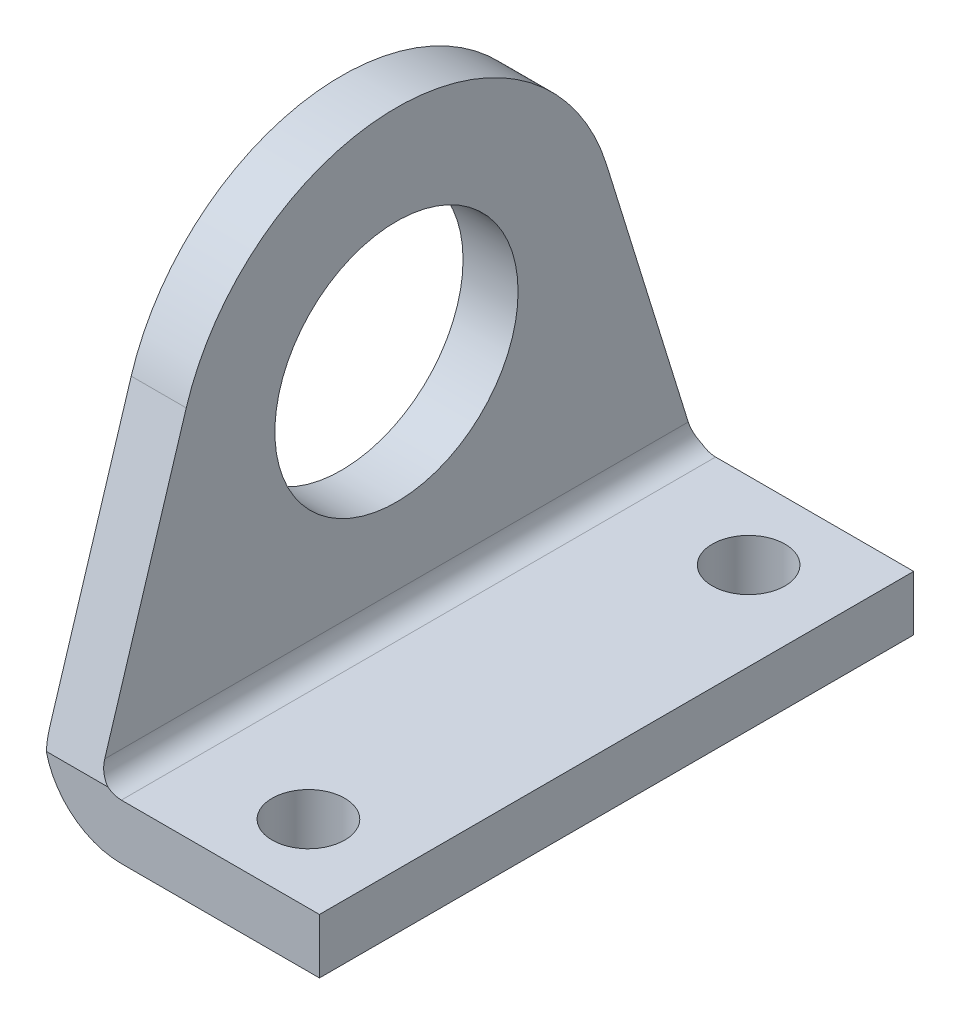
ISO-10303-21;
HEADER;
FILE_DESCRIPTION(('STEP AP214'),'2;1');
FILE_NAME('part.step','',(''),(''),'','','');
FILE_SCHEMA(('AUTOMOTIVE_DESIGN { 1 0 10303 214 1 1 1 1 }'));
ENDSEC;
DATA;
#1=APPLICATION_CONTEXT('core data for automotive mechanical design processes');
#2=APPLICATION_PROTOCOL_DEFINITION('international standard','automotive_design',2000,#1);
#3=PRODUCT_CONTEXT('',#1,'mechanical');
#4=PRODUCT('Part','Part','',(#3));
#5=PRODUCT_RELATED_PRODUCT_CATEGORY('part','',(#4));
#6=PRODUCT_DEFINITION_FORMATION('','',#4);
#7=PRODUCT_DEFINITION_CONTEXT('part definition',#1,'design');
#8=PRODUCT_DEFINITION('design','',#6,#7);
#9=PRODUCT_DEFINITION_SHAPE('','',#8);
#10=(LENGTH_UNIT() NAMED_UNIT(*) SI_UNIT(.MILLI.,.METRE.));
#11=(NAMED_UNIT(*) PLANE_ANGLE_UNIT() SI_UNIT($,.RADIAN.));
#12=(NAMED_UNIT(*) SI_UNIT($,.STERADIAN.) SOLID_ANGLE_UNIT());
#13=UNCERTAINTY_MEASURE_WITH_UNIT(LENGTH_MEASURE(1.E-05),#10,'distance_accuracy_value','');
#14=(GEOMETRIC_REPRESENTATION_CONTEXT(3) GLOBAL_UNCERTAINTY_ASSIGNED_CONTEXT((#13)) GLOBAL_UNIT_ASSIGNED_CONTEXT((#10,
#11,#12)) REPRESENTATION_CONTEXT('',''));
#15=CARTESIAN_POINT('',(0.,0.,0.));
#16=DIRECTION('',(0.,0.,1.));
#17=DIRECTION('',(1.,0.,0.));
#18=AXIS2_PLACEMENT_3D('',#15,#16,#17);
#19=CARTESIAN_POINT('',(17.,5.1,20.));
#20=DIRECTION('',(0.,1.,0.));
#21=DIRECTION('',(0.,0.,1.));
#22=AXIS2_PLACEMENT_3D('',#19,#20,#21);
#23=CYLINDRICAL_SURFACE('',#22,3.3);
#24=CARTESIAN_POINT('',(17.,0.,20.));
#25=DIRECTION('',(0.,1.,0.));
#26=DIRECTION('',(0.,0.,1.));
#27=AXIS2_PLACEMENT_3D('',#24,#25,#26);
#28=CIRCLE('',#27,3.3);
#29=CARTESIAN_POINT('',(17.,0.,23.3));
#30=VERTEX_POINT('',#29);
#31=EDGE_CURVE('E147',#30,#30,#28,.F.);
#32=ORIENTED_EDGE('',*,*,#31,.T.);
#33=EDGE_LOOP('',(#32));
#34=FACE_BOUND('',#33,.T.);
#35=CARTESIAN_POINT('',(17.,5.,20.));
#36=DIRECTION('',(0.,1.,0.));
#37=DIRECTION('',(0.,0.,1.));
#38=AXIS2_PLACEMENT_3D('',#35,#36,#37);
#39=CIRCLE('',#38,3.3);
#40=CARTESIAN_POINT('',(17.,5.,23.3));
#41=VERTEX_POINT('',#40);
#42=EDGE_CURVE('E19',#41,#41,#39,.T.);
#43=ORIENTED_EDGE('',*,*,#42,.T.);
#44=EDGE_LOOP('',(#43));
#45=FACE_BOUND('',#44,.T.);
#46=ADVANCED_FACE('F16',(#34,#45),#23,.F.);
#47=CARTESIAN_POINT('',(17.,5.1,-20.));
#48=DIRECTION('',(0.,1.,0.));
#49=DIRECTION('',(0.,0.,1.));
#50=AXIS2_PLACEMENT_3D('',#47,#48,#49);
#51=CYLINDRICAL_SURFACE('',#50,3.3);
#52=CARTESIAN_POINT('',(17.,0.,-20.));
#53=DIRECTION('',(0.,1.,0.));
#54=DIRECTION('',(0.,0.,1.));
#55=AXIS2_PLACEMENT_3D('',#52,#53,#54);
#56=CIRCLE('',#55,3.3);
#57=CARTESIAN_POINT('',(17.,0.,-16.7));
#58=VERTEX_POINT('',#57);
#59=EDGE_CURVE('E157',#58,#58,#56,.F.);
#60=ORIENTED_EDGE('',*,*,#59,.T.);
#61=EDGE_LOOP('',(#60));
#62=FACE_BOUND('',#61,.T.);
#63=CARTESIAN_POINT('',(17.,5.,-20.));
#64=DIRECTION('',(0.,1.,0.));
#65=DIRECTION('',(0.,0.,1.));
#66=AXIS2_PLACEMENT_3D('',#63,#64,#65);
#67=CIRCLE('',#66,3.3);
#68=CARTESIAN_POINT('',(17.,5.,-16.7));
#69=VERTEX_POINT('',#68);
#70=EDGE_CURVE('E148',#69,#69,#67,.T.);
#71=ORIENTED_EDGE('',*,*,#70,.T.);
#72=EDGE_LOOP('',(#71));
#73=FACE_BOUND('',#72,.T.);
#74=ADVANCED_FACE('F208',(#62,#73),#51,.F.);
#75=CARTESIAN_POINT('',(25.,0.,27.));
#76=DIRECTION('',(-1.,0.,0.));
#77=DIRECTION('',(0.,0.,1.));
#78=AXIS2_PLACEMENT_3D('',#75,#76,#77);
#79=PLANE('',#78);
#80=DIRECTION('',(0.,0.,-1.));
#81=VECTOR('',#80,1.);
#82=CARTESIAN_POINT('',(25.,5.,27.));
#83=LINE('',#82,#81);
#84=CARTESIAN_POINT('',(25.,5.,-27.));
#85=VERTEX_POINT('',#84);
#86=CARTESIAN_POINT('',(25.,5.,27.));
#87=VERTEX_POINT('',#86);
#88=EDGE_CURVE('E144',#85,#87,#83,.F.);
#89=ORIENTED_EDGE('',*,*,#88,.T.);
#90=DIRECTION('',(0.,1.,0.));
#91=VECTOR('',#90,1.);
#92=CARTESIAN_POINT('',(25.,7.,27.));
#93=LINE('',#92,#91);
#94=CARTESIAN_POINT('',(25.,0.,27.));
#95=VERTEX_POINT('',#94);
#96=EDGE_CURVE('E121',#95,#87,#93,.T.);
#97=ORIENTED_EDGE('',*,*,#96,.F.);
#98=DIRECTION('',(0.,0.,1.));
#99=VECTOR('',#98,1.);
#100=CARTESIAN_POINT('',(25.,0.,27.));
#101=LINE('',#100,#99);
#102=CARTESIAN_POINT('',(25.,0.,-27.));
#103=VERTEX_POINT('',#102);
#104=EDGE_CURVE('E138',#95,#103,#101,.F.);
#105=ORIENTED_EDGE('',*,*,#104,.T.);
#106=DIRECTION('',(0.,1.,0.));
#107=VECTOR('',#106,1.);
#108=CARTESIAN_POINT('',(25.,7.,-27.));
#109=LINE('',#108,#107);
#110=EDGE_CURVE('E132',#103,#85,#109,.T.);
#111=ORIENTED_EDGE('',*,*,#110,.T.);
#112=EDGE_LOOP('',(#89,#97,#105,#111));
#113=FACE_BOUND('',#112,.T.);
#114=ADVANCED_FACE('F198',(#113),#79,.F.);
#115=CARTESIAN_POINT('',(25.,5.,27.));
#116=DIRECTION('',(0.,-1.,0.));
#117=DIRECTION('',(0.,0.,-1.));
#118=AXIS2_PLACEMENT_3D('',#115,#116,#117);
#119=PLANE('',#118);
#120=DIRECTION('',(0.,0.,1.));
#121=VECTOR('',#120,1.);
#122=CARTESIAN_POINT('',(7.,5.,27.));
#123=LINE('',#122,#121);
#124=CARTESIAN_POINT('',(7.,5.,-27.));
#125=VERTEX_POINT('',#124);
#126=CARTESIAN_POINT('',(7.,5.,27.));
#127=VERTEX_POINT('',#126);
#128=EDGE_CURVE('E86',#125,#127,#123,.T.);
#129=ORIENTED_EDGE('',*,*,#128,.T.);
#130=DIRECTION('',(1.,0.,0.));
#131=VECTOR('',#130,1.);
#132=CARTESIAN_POINT('',(7.,5.,27.));
#133=LINE('',#132,#131);
#134=EDGE_CURVE('E90',#87,#127,#133,.F.);
#135=ORIENTED_EDGE('',*,*,#134,.F.);
#136=ORIENTED_EDGE('',*,*,#88,.F.);
#137=DIRECTION('',(1.,0.,0.));
#138=VECTOR('',#137,1.);
#139=CARTESIAN_POINT('',(7.,5.,-27.));
#140=LINE('',#139,#138);
#141=EDGE_CURVE('E127',#85,#125,#140,.F.);
#142=ORIENTED_EDGE('',*,*,#141,.T.);
#143=EDGE_LOOP('',(#129,#135,#136,#142));
#144=FACE_BOUND('',#143,.T.);
#145=ORIENTED_EDGE('',*,*,#70,.F.);
#146=EDGE_LOOP('',(#145));
#147=FACE_BOUND('',#146,.T.);
#148=ORIENTED_EDGE('',*,*,#42,.F.);
#149=EDGE_LOOP('',(#148));
#150=FACE_BOUND('',#149,.T.);
#151=ADVANCED_FACE('F195',(#144,#147,#150),#119,.F.);
#152=CARTESIAN_POINT('',(7.,0.,27.));
#153=DIRECTION('',(0.,1.,0.));
#154=DIRECTION('',(0.,0.,1.));
#155=AXIS2_PLACEMENT_3D('',#152,#153,#154);
#156=PLANE('',#155);
#157=ORIENTED_EDGE('',*,*,#104,.F.);
#158=DIRECTION('',(1.,0.,0.));
#159=VECTOR('',#158,1.);
#160=CARTESIAN_POINT('',(7.,0.,27.));
#161=LINE('',#160,#159);
#162=CARTESIAN_POINT('',(7.,0.,27.));
#163=VERTEX_POINT('',#162);
#164=EDGE_CURVE('E124',#163,#95,#161,.T.);
#165=ORIENTED_EDGE('',*,*,#164,.F.);
#166=DIRECTION('',(0.,0.,1.));
#167=VECTOR('',#166,1.);
#168=CARTESIAN_POINT('',(7.,0.,27.));
#169=LINE('',#168,#167);
#170=CARTESIAN_POINT('',(7.,0.,-27.));
#171=VERTEX_POINT('',#170);
#172=EDGE_CURVE('E141',#171,#163,#169,.T.);
#173=ORIENTED_EDGE('',*,*,#172,.F.);
#174=DIRECTION('',(1.,0.,0.));
#175=VECTOR('',#174,1.);
#176=CARTESIAN_POINT('',(7.,0.,-27.));
#177=LINE('',#176,#175);
#178=EDGE_CURVE('E135',#171,#103,#177,.T.);
#179=ORIENTED_EDGE('',*,*,#178,.T.);
#180=EDGE_LOOP('',(#157,#165,#173,#179));
#181=FACE_BOUND('',#180,.T.);
#182=ORIENTED_EDGE('',*,*,#59,.F.);
#183=EDGE_LOOP('',(#182));
#184=FACE_BOUND('',#183,.T.);
#185=ORIENTED_EDGE('',*,*,#31,.F.);
#186=EDGE_LOOP('',(#185));
#187=FACE_BOUND('',#186,.T.);
#188=ADVANCED_FACE('F197',(#181,#184,#187),#156,.F.);
#189=CARTESIAN_POINT('',(7.,7.,-27.));
#190=DIRECTION('',(0.,0.,1.));
#191=DIRECTION('',(1.,0.,0.));
#192=AXIS2_PLACEMENT_3D('',#189,#190,#191);
#193=PLANE('',#192);
#194=CARTESIAN_POINT('',(7.,7.,-27.));
#195=DIRECTION('',(0.,0.,1.));
#196=DIRECTION('',(1.,0.,0.));
#197=AXIS2_PLACEMENT_3D('',#194,#195,#196);
#198=CIRCLE('',#197,2.);
#199=CARTESIAN_POINT('',(5.77005648835697,5.42290172843693,-27.));
#200=VERTEX_POINT('',#199);
#201=EDGE_CURVE('E79',#200,#125,#198,.T.);
#202=ORIENTED_EDGE('',*,*,#201,.T.);
#203=ORIENTED_EDGE('',*,*,#141,.F.);
#204=ORIENTED_EDGE('',*,*,#110,.F.);
#205=ORIENTED_EDGE('',*,*,#178,.F.);
#206=CARTESIAN_POINT('',(7.,7.,-27.));
#207=DIRECTION('',(0.,0.,1.));
#208=DIRECTION('',(1.,0.,0.));
#209=AXIS2_PLACEMENT_3D('',#206,#207,#208);
#210=CIRCLE('',#209,7.);
#211=CARTESIAN_POINT('',(0.179973530708787,5.42290172843693,-27.));
#212=VERTEX_POINT('',#211);
#213=EDGE_CURVE('E104',#212,#171,#210,.T.);
#214=ORIENTED_EDGE('',*,*,#213,.F.);
#215=DIRECTION('',(1.,0.,0.));
#216=VECTOR('',#215,1.);
#217=CARTESIAN_POINT('',(17.,5.42290172843686,-27.));
#218=LINE('',#217,#216);
#219=EDGE_CURVE('E95',#200,#212,#218,.F.);
#220=ORIENTED_EDGE('',*,*,#219,.F.);
#221=EDGE_LOOP('',(#202,#203,#204,#205,#214,#220));
#222=FACE_BOUND('',#221,.T.);
#223=ADVANCED_FACE('F102',(#222),#193,.F.);
#224=CARTESIAN_POINT('',(5.,6.99999999999999,27.));
#225=DIRECTION('',(-1.,0.,0.));
#226=DIRECTION('',(0.,0.,1.));
#227=AXIS2_PLACEMENT_3D('',#224,#225,#226);
#228=PLANE('',#227);
#229=DIRECTION('',(0.,0.,1.));
#230=VECTOR('',#229,1.);
#231=CARTESIAN_POINT('',(5.,7.,27.));
#232=LINE('',#231,#230);
#233=CARTESIAN_POINT('',(5.,7.,26.5115856829885));
#234=VERTEX_POINT('',#233);
#235=CARTESIAN_POINT('',(5.,7.,-26.5115856829886));
#236=VERTEX_POINT('',#235);
#237=EDGE_CURVE('E116',#234,#236,#232,.F.);
#238=ORIENTED_EDGE('',*,*,#237,.T.);
#239=DIRECTION('',(0.,0.955240566971033,0.29583011883995));
#240=VECTOR('',#239,1.);
#241=CARTESIAN_POINT('',(5.,30.916602376799,-19.1048113394207));
#242=LINE('',#241,#240);
#243=CARTESIAN_POINT('',(5.,30.916602376799,-19.1048113394207));
#244=VERTEX_POINT('',#243);
#245=EDGE_CURVE('E99',#244,#236,#242,.F.);
#246=ORIENTED_EDGE('',*,*,#245,.F.);
#247=CARTESIAN_POINT('',(5.,25.,0.));
#248=DIRECTION('',(1.,0.,0.));
#249=DIRECTION('',(0.,0.,-1.));
#250=AXIS2_PLACEMENT_3D('',#247,#248,#249);
#251=CIRCLE('',#250,20.);
#252=CARTESIAN_POINT('',(5.,30.916602376799,19.1048113394207));
#253=VERTEX_POINT('',#252);
#254=EDGE_CURVE('E108',#253,#244,#251,.F.);
#255=ORIENTED_EDGE('',*,*,#254,.F.);
#256=DIRECTION('',(0.,-0.955240566971033,0.29583011883995));
#257=VECTOR('',#256,1.);
#258=CARTESIAN_POINT('',(5.,-1.,28.9891196493526));
#259=LINE('',#258,#257);
#260=EDGE_CURVE('E388',#234,#253,#259,.F.);
#261=ORIENTED_EDGE('',*,*,#260,.F.);
#262=EDGE_LOOP('',(#238,#246,#255,#261));
#263=FACE_BOUND('',#262,.T.);
#264=CARTESIAN_POINT('',(5.,25.,0.));
#265=DIRECTION('',(1.,0.,0.));
#266=DIRECTION('',(0.,0.,-1.));
#267=AXIS2_PLACEMENT_3D('',#264,#265,#266);
#268=CIRCLE('',#267,11.05);
#269=CARTESIAN_POINT('',(5.,25.,-11.05));
#270=VERTEX_POINT('',#269);
#271=EDGE_CURVE('E118',#270,#270,#268,.F.);
#272=ORIENTED_EDGE('',*,*,#271,.T.);
#273=EDGE_LOOP('',(#272));
#274=FACE_BOUND('',#273,.T.);
#275=ADVANCED_FACE('F243',(#263,#274),#228,.F.);
#276=CARTESIAN_POINT('',(7.,7.,27.));
#277=DIRECTION('',(0.,0.,1.));
#278=DIRECTION('',(1.,0.,0.));
#279=AXIS2_PLACEMENT_3D('',#276,#277,#278);
#280=PLANE('',#279);
#281=ORIENTED_EDGE('',*,*,#96,.T.);
#282=ORIENTED_EDGE('',*,*,#134,.T.);
#283=CARTESIAN_POINT('',(7.,7.,27.));
#284=DIRECTION('',(0.,0.,1.));
#285=DIRECTION('',(1.,0.,0.));
#286=AXIS2_PLACEMENT_3D('',#283,#284,#285);
#287=CIRCLE('',#286,2.);
#288=CARTESIAN_POINT('',(5.77005648835705,5.42290172843687,27.));
#289=VERTEX_POINT('',#288);
#290=EDGE_CURVE('E119',#127,#289,#287,.F.);
#291=ORIENTED_EDGE('',*,*,#290,.T.);
#292=DIRECTION('',(1.,0.,0.));
#293=VECTOR('',#292,1.);
#294=CARTESIAN_POINT('',(17.,5.42290172843687,27.));
#295=LINE('',#294,#293);
#296=CARTESIAN_POINT('',(0.179973530708799,5.42290172843687,27.));
#297=VERTEX_POINT('',#296);
#298=EDGE_CURVE('E174',#297,#289,#295,.T.);
#299=ORIENTED_EDGE('',*,*,#298,.F.);
#300=CARTESIAN_POINT('',(7.,7.,27.));
#301=DIRECTION('',(0.,0.,1.));
#302=DIRECTION('',(1.,0.,0.));
#303=AXIS2_PLACEMENT_3D('',#300,#301,#302);
#304=CIRCLE('',#303,7.);
#305=EDGE_CURVE('E115',#163,#297,#304,.F.);
#306=ORIENTED_EDGE('',*,*,#305,.F.);
#307=ORIENTED_EDGE('',*,*,#164,.T.);
#308=EDGE_LOOP('',(#281,#282,#291,#299,#306,#307));
#309=FACE_BOUND('',#308,.T.);
#310=ADVANCED_FACE('F240',(#309),#280,.T.);
#311=CARTESIAN_POINT('',(7.,7.,27.));
#312=DIRECTION('',(0.,0.,1.));
#313=DIRECTION('',(1.,0.,0.));
#314=AXIS2_PLACEMENT_3D('',#311,#312,#313);
#315=CYLINDRICAL_SURFACE('',#314,2.);
#316=CARTESIAN_POINT('',(7.,7.,26.5115856829885));
#317=DIRECTION('',(0.,0.29583011883995,0.955240566971033));
#318=DIRECTION('',(0.,-0.955240566971033,0.29583011883995));
#319=AXIS2_PLACEMENT_3D('',#316,#317,#318);
#320=ELLIPSE('',#319,2.09371342586694,2.);
#321=EDGE_CURVE('E171',#289,#234,#320,.F.);
#322=ORIENTED_EDGE('',*,*,#321,.F.);
#323=ORIENTED_EDGE('',*,*,#290,.F.);
#324=ORIENTED_EDGE('',*,*,#128,.F.);
#325=ORIENTED_EDGE('',*,*,#201,.F.);
#326=CARTESIAN_POINT('',(7.,7.,-26.5115856829886));
#327=DIRECTION('',(0.,0.29583011883995,-0.955240566971033));
#328=DIRECTION('',(0.,0.955240566971033,0.29583011883995));
#329=AXIS2_PLACEMENT_3D('',#326,#327,#328);
#330=ELLIPSE('',#329,2.09371342586694,2.);
#331=EDGE_CURVE('E83',#236,#200,#330,.F.);
#332=ORIENTED_EDGE('',*,*,#331,.F.);
#333=ORIENTED_EDGE('',*,*,#237,.F.);
#334=EDGE_LOOP('',(#322,#323,#324,#325,#332,#333));
#335=FACE_BOUND('',#334,.T.);
#336=ADVANCED_FACE('F82',(#335),#315,.F.);
#337=CARTESIAN_POINT('',(5.1,25.,0.));
#338=DIRECTION('',(1.,0.,0.));
#339=DIRECTION('',(0.,0.,-1.));
#340=AXIS2_PLACEMENT_3D('',#337,#338,#339);
#341=CYLINDRICAL_SURFACE('',#340,11.05);
#342=CARTESIAN_POINT('',(0.,25.,0.));
#343=DIRECTION('',(1.,0.,0.));
#344=DIRECTION('',(0.,0.,-1.));
#345=AXIS2_PLACEMENT_3D('',#342,#343,#344);
#346=CIRCLE('',#345,11.05);
#347=CARTESIAN_POINT('',(0.,25.,-11.05));
#348=VERTEX_POINT('',#347);
#349=EDGE_CURVE('E167',#348,#348,#346,.F.);
#350=ORIENTED_EDGE('',*,*,#349,.T.);
#351=EDGE_LOOP('',(#350));
#352=FACE_BOUND('',#351,.T.);
#353=ORIENTED_EDGE('',*,*,#271,.F.);
#354=EDGE_LOOP('',(#353));
#355=FACE_BOUND('',#354,.T.);
#356=ADVANCED_FACE('F233',(#352,#355),#341,.F.);
#357=CARTESIAN_POINT('',(7.,7.,27.));
#358=DIRECTION('',(0.,0.,1.));
#359=DIRECTION('',(1.,0.,0.));
#360=AXIS2_PLACEMENT_3D('',#357,#358,#359);
#361=CYLINDRICAL_SURFACE('',#360,7.);
#362=ORIENTED_EDGE('',*,*,#172,.T.);
#363=ORIENTED_EDGE('',*,*,#305,.T.);
#364=CARTESIAN_POINT('',(7.,7.,26.5115856829885));
#365=DIRECTION('',(0.,0.29583011883995,0.955240566971033));
#366=DIRECTION('',(0.,-0.955240566971033,0.29583011883995));
#367=AXIS2_PLACEMENT_3D('',#364,#365,#366);
#368=ELLIPSE('',#367,7.32799699053429,7.);
#369=CARTESIAN_POINT('',(0.,6.99999999999999,26.5115856829885));
#370=VERTEX_POINT('',#369);
#371=EDGE_CURVE('E175',#370,#297,#368,.T.);
#372=ORIENTED_EDGE('',*,*,#371,.F.);
#373=DIRECTION('',(0.,0.,-1.));
#374=VECTOR('',#373,1.);
#375=CARTESIAN_POINT('',(0.,6.99999999999999,27.));
#376=LINE('',#375,#374);
#377=CARTESIAN_POINT('',(0.,7.,-26.5115856829885));
#378=VERTEX_POINT('',#377);
#379=EDGE_CURVE('E170',#370,#378,#376,.T.);
#380=ORIENTED_EDGE('',*,*,#379,.T.);
#381=CARTESIAN_POINT('',(7.,7.,-26.5115856829886));
#382=DIRECTION('',(0.,0.29583011883995,-0.955240566971033));
#383=DIRECTION('',(0.,0.955240566971033,0.29583011883995));
#384=AXIS2_PLACEMENT_3D('',#381,#382,#383);
#385=ELLIPSE('',#384,7.32799699053429,7.);
#386=EDGE_CURVE('E106',#212,#378,#385,.T.);
#387=ORIENTED_EDGE('',*,*,#386,.F.);
#388=ORIENTED_EDGE('',*,*,#213,.T.);
#389=EDGE_LOOP('',(#362,#363,#372,#380,#387,#388));
#390=FACE_BOUND('',#389,.T.);
#391=ADVANCED_FACE('F230',(#390),#361,.T.);
#392=CARTESIAN_POINT('',(17.,30.916602376799,-19.1048113394207));
#393=DIRECTION('',(0.,0.29583011883995,-0.955240566971033));
#394=DIRECTION('',(0.,0.955240566971033,0.29583011883995));
#395=AXIS2_PLACEMENT_3D('',#392,#393,#394);
#396=PLANE('',#395);
#397=DIRECTION('',(0.,0.955240566971034,0.295830118839947));
#398=VECTOR('',#397,1.);
#399=CARTESIAN_POINT('',(0.,6.99999999999999,-26.5115856829885));
#400=LINE('',#399,#398);
#401=CARTESIAN_POINT('',(0.,30.916602376799,-19.1048113394207));
#402=VERTEX_POINT('',#401);
#403=EDGE_CURVE('E166',#378,#402,#400,.T.);
#404=ORIENTED_EDGE('',*,*,#403,.T.);
#405=DIRECTION('',(1.,0.,0.));
#406=VECTOR('',#405,1.);
#407=CARTESIAN_POINT('',(17.,30.916602376799,-19.1048113394207));
#408=LINE('',#407,#406);
#409=EDGE_CURVE('E112',#244,#402,#408,.F.);
#410=ORIENTED_EDGE('',*,*,#409,.F.);
#411=ORIENTED_EDGE('',*,*,#245,.T.);
#412=ORIENTED_EDGE('',*,*,#331,.T.);
#413=ORIENTED_EDGE('',*,*,#219,.T.);
#414=ORIENTED_EDGE('',*,*,#386,.T.);
#415=EDGE_LOOP('',(#404,#410,#411,#412,#413,#414));
#416=FACE_BOUND('',#415,.T.);
#417=ADVANCED_FACE('F94',(#416),#396,.T.);
#418=CARTESIAN_POINT('',(17.,25.,0.));
#419=DIRECTION('',(1.,0.,0.));
#420=DIRECTION('',(0.,0.,-1.));
#421=AXIS2_PLACEMENT_3D('',#418,#419,#420);
#422=CYLINDRICAL_SURFACE('',#421,20.);
#423=ORIENTED_EDGE('',*,*,#409,.T.);
#424=CARTESIAN_POINT('',(0.,25.,0.));
#425=DIRECTION('',(1.,0.,0.));
#426=DIRECTION('',(0.,0.,-1.));
#427=AXIS2_PLACEMENT_3D('',#424,#425,#426);
#428=CIRCLE('',#427,20.);
#429=CARTESIAN_POINT('',(0.,30.916602376799,19.1048113394207));
#430=VERTEX_POINT('',#429);
#431=EDGE_CURVE('E25',#402,#430,#428,.T.);
#432=ORIENTED_EDGE('',*,*,#431,.T.);
#433=DIRECTION('',(1.,0.,0.));
#434=VECTOR('',#433,1.);
#435=CARTESIAN_POINT('',(17.,30.916602376799,19.1048113394207));
#436=LINE('',#435,#434);
#437=EDGE_CURVE('E33',#253,#430,#436,.F.);
#438=ORIENTED_EDGE('',*,*,#437,.F.);
#439=ORIENTED_EDGE('',*,*,#254,.T.);
#440=EDGE_LOOP('',(#423,#432,#438,#439));
#441=FACE_BOUND('',#440,.T.);
#442=ADVANCED_FACE('F220',(#441),#422,.T.);
#443=CARTESIAN_POINT('',(17.,-1.,28.9891196493526));
#444=DIRECTION('',(0.,0.29583011883995,0.955240566971033));
#445=DIRECTION('',(0.,-0.955240566971033,0.29583011883995));
#446=AXIS2_PLACEMENT_3D('',#443,#444,#445);
#447=PLANE('',#446);
#448=ORIENTED_EDGE('',*,*,#298,.T.);
#449=ORIENTED_EDGE('',*,*,#321,.T.);
#450=ORIENTED_EDGE('',*,*,#260,.T.);
#451=ORIENTED_EDGE('',*,*,#437,.T.);
#452=DIRECTION('',(0.,-0.955240566971034,0.295830118839947));
#453=VECTOR('',#452,1.);
#454=CARTESIAN_POINT('',(0.,30.916602376799,19.1048113394207));
#455=LINE('',#454,#453);
#456=EDGE_CURVE('E11',#430,#370,#455,.T.);
#457=ORIENTED_EDGE('',*,*,#456,.T.);
#458=ORIENTED_EDGE('',*,*,#371,.T.);
#459=EDGE_LOOP('',(#448,#449,#450,#451,#457,#458));
#460=FACE_BOUND('',#459,.T.);
#461=ADVANCED_FACE('F214',(#460),#447,.T.);
#462=CARTESIAN_POINT('',(0.,50.,27.));
#463=DIRECTION('',(1.,0.,0.));
#464=DIRECTION('',(0.,0.,-1.));
#465=AXIS2_PLACEMENT_3D('',#462,#463,#464);
#466=PLANE('',#465);
#467=ORIENTED_EDGE('',*,*,#431,.F.);
#468=ORIENTED_EDGE('',*,*,#403,.F.);
#469=ORIENTED_EDGE('',*,*,#379,.F.);
#470=ORIENTED_EDGE('',*,*,#456,.F.);
#471=EDGE_LOOP('',(#467,#468,#469,#470));
#472=FACE_BOUND('',#471,.T.);
#473=ORIENTED_EDGE('',*,*,#349,.F.);
#474=EDGE_LOOP('',(#473));
#475=FACE_BOUND('',#474,.T.);
#476=ADVANCED_FACE('F212',(#472,#475),#466,.F.);
#477=CLOSED_SHELL('',(#46,#74,#114,#151,#188,#223,#275,#310,#336,#356,#391,#417,#442,#461,#476));
#478=MANIFOLD_SOLID_BREP('B1',#477);
#479=ADVANCED_BREP_SHAPE_REPRESENTATION('',(#18,#478),#14);
#480=SHAPE_DEFINITION_REPRESENTATION(#9,#479);
ENDSEC;
END-ISO-10303-21;
